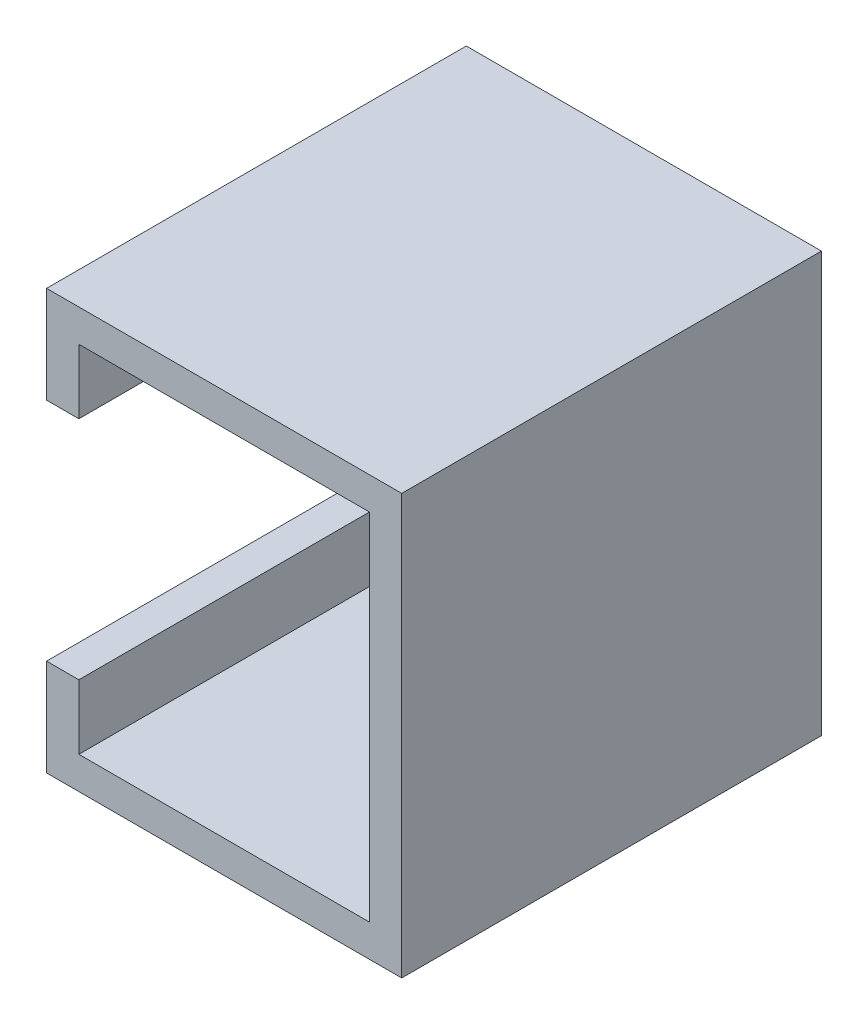
ISO-10303-21;
HEADER;
FILE_DESCRIPTION(('STEP AP214'),'2;1');
FILE_NAME('part.step','',(''),(''),'','','');
FILE_SCHEMA(('AUTOMOTIVE_DESIGN { 1 0 10303 214 1 1 1 1 }'));
ENDSEC;
DATA;
#1=APPLICATION_CONTEXT('core data for automotive mechanical design processes');
#2=APPLICATION_PROTOCOL_DEFINITION('international standard','automotive_design',2000,#1);
#3=PRODUCT_CONTEXT('',#1,'mechanical');
#4=PRODUCT('Part','Part','',(#3));
#5=PRODUCT_RELATED_PRODUCT_CATEGORY('part','',(#4));
#6=PRODUCT_DEFINITION_FORMATION('','',#4);
#7=PRODUCT_DEFINITION_CONTEXT('part definition',#1,'design');
#8=PRODUCT_DEFINITION('design','',#6,#7);
#9=PRODUCT_DEFINITION_SHAPE('','',#8);
#10=(LENGTH_UNIT() NAMED_UNIT(*) SI_UNIT(.MILLI.,.METRE.));
#11=(NAMED_UNIT(*) PLANE_ANGLE_UNIT() SI_UNIT($,.RADIAN.));
#12=(NAMED_UNIT(*) SI_UNIT($,.STERADIAN.) SOLID_ANGLE_UNIT());
#13=UNCERTAINTY_MEASURE_WITH_UNIT(LENGTH_MEASURE(1.E-05),#10,'distance_accuracy_value','');
#14=(GEOMETRIC_REPRESENTATION_CONTEXT(3) GLOBAL_UNCERTAINTY_ASSIGNED_CONTEXT((#13)) GLOBAL_UNIT_ASSIGNED_CONTEXT((#10,
#11,#12)) REPRESENTATION_CONTEXT('',''));
#15=CARTESIAN_POINT('',(0.,0.,0.));
#16=DIRECTION('',(0.,0.,1.));
#17=DIRECTION('',(1.,0.,0.));
#18=AXIS2_PLACEMENT_3D('',#15,#16,#17);
#19=CARTESIAN_POINT('',(1.,0.,0.));
#20=DIRECTION('',(-1.,0.,0.));
#21=DIRECTION('',(0.,0.,1.));
#22=AXIS2_PLACEMENT_3D('',#19,#20,#21);
#23=PLANE('',#22);
#24=DIRECTION('',(0.,-1.,0.));
#25=VECTOR('',#24,1.);
#26=CARTESIAN_POINT('',(1.,0.,0.));
#27=LINE('',#26,#25);
#28=CARTESIAN_POINT('',(1.,12.,0.));
#29=VERTEX_POINT('',#28);
#30=CARTESIAN_POINT('',(1.,10.,0.));
#31=VERTEX_POINT('',#30);
#32=EDGE_CURVE('E209',#29,#31,#27,.T.);
#33=ORIENTED_EDGE('',*,*,#32,.T.);
#34=DIRECTION('',(0.,0.,1.));
#35=VECTOR('',#34,1.);
#36=CARTESIAN_POINT('',(1.,10.,-19.0710678118655));
#37=LINE('',#36,#35);
#38=CARTESIAN_POINT('',(1.,10.,-12.));
#39=VERTEX_POINT('',#38);
#40=EDGE_CURVE('E300',#39,#31,#37,.T.);
#41=ORIENTED_EDGE('',*,*,#40,.F.);
#42=DIRECTION('',(0.,1.,0.));
#43=VECTOR('',#42,1.);
#44=CARTESIAN_POINT('',(1.,0.,-12.));
#45=LINE('',#44,#43);
#46=CARTESIAN_POINT('',(1.,12.,-12.));
#47=VERTEX_POINT('',#46);
#48=EDGE_CURVE('E252',#39,#47,#45,.T.);
#49=ORIENTED_EDGE('',*,*,#48,.T.);
#50=DIRECTION('',(0.,0.,1.));
#51=VECTOR('',#50,1.);
#52=CARTESIAN_POINT('',(1.,12.,0.));
#53=LINE('',#52,#51);
#54=EDGE_CURVE('E251',#47,#29,#53,.T.);
#55=ORIENTED_EDGE('',*,*,#54,.T.);
#56=EDGE_LOOP('',(#33,#41,#49,#55));
#57=FACE_BOUND('',#56,.T.);
#58=ADVANCED_FACE('F39',(#57),#23,.F.);
#59=CARTESIAN_POINT('',(11.,0.,0.));
#60=DIRECTION('',(0.,0.,-1.));
#61=DIRECTION('',(-1.,0.,0.));
#62=AXIS2_PLACEMENT_3D('',#59,#60,#61);
#63=PLANE('',#62);
#64=DIRECTION('',(0.,-1.,0.));
#65=VECTOR('',#64,1.);
#66=CARTESIAN_POINT('',(0.,0.,0.));
#67=LINE('',#66,#65);
#68=CARTESIAN_POINT('',(0.,13.,0.));
#69=VERTEX_POINT('',#68);
#70=CARTESIAN_POINT('',(0.,10.,0.));
#71=VERTEX_POINT('',#70);
#72=EDGE_CURVE('E157',#69,#71,#67,.T.);
#73=ORIENTED_EDGE('',*,*,#72,.T.);
#74=DIRECTION('',(-1.,0.,0.));
#75=VECTOR('',#74,1.);
#76=CARTESIAN_POINT('',(0.,10.,0.));
#77=LINE('',#76,#75);
#78=EDGE_CURVE('E140',#31,#71,#77,.T.);
#79=ORIENTED_EDGE('',*,*,#78,.F.);
#80=ORIENTED_EDGE('',*,*,#32,.F.);
#81=DIRECTION('',(-1.,0.,0.));
#82=VECTOR('',#81,1.);
#83=CARTESIAN_POINT('',(11.,12.,0.));
#84=LINE('',#83,#82);
#85=CARTESIAN_POINT('',(10.,12.,0.));
#86=VERTEX_POINT('',#85);
#87=EDGE_CURVE('E265',#86,#29,#84,.T.);
#88=ORIENTED_EDGE('',*,*,#87,.F.);
#89=DIRECTION('',(0.,-1.,0.));
#90=VECTOR('',#89,1.);
#91=CARTESIAN_POINT('',(10.,0.,0.));
#92=LINE('',#91,#90);
#93=CARTESIAN_POINT('',(10.,1.,0.));
#94=VERTEX_POINT('',#93);
#95=EDGE_CURVE('E63',#86,#94,#92,.T.);
#96=ORIENTED_EDGE('',*,*,#95,.T.);
#97=DIRECTION('',(-1.,0.,0.));
#98=VECTOR('',#97,1.);
#99=CARTESIAN_POINT('',(11.,1.,0.));
#100=LINE('',#99,#98);
#101=CARTESIAN_POINT('',(1.,1.,0.));
#102=VERTEX_POINT('',#101);
#103=EDGE_CURVE('E158',#94,#102,#100,.T.);
#104=ORIENTED_EDGE('',*,*,#103,.T.);
#105=CARTESIAN_POINT('',(1.,3.,0.));
#106=VERTEX_POINT('',#105);
#107=EDGE_CURVE('E149',#106,#102,#27,.T.);
#108=ORIENTED_EDGE('',*,*,#107,.F.);
#109=DIRECTION('',(1.,0.,0.));
#110=VECTOR('',#109,1.);
#111=CARTESIAN_POINT('',(0.,3.,0.));
#112=LINE('',#111,#110);
#113=CARTESIAN_POINT('',(0.,3.,0.));
#114=VERTEX_POINT('',#113);
#115=EDGE_CURVE('E133',#114,#106,#112,.T.);
#116=ORIENTED_EDGE('',*,*,#115,.F.);
#117=CARTESIAN_POINT('',(0.,0.,0.));
#118=VERTEX_POINT('',#117);
#119=EDGE_CURVE('E146',#114,#118,#67,.T.);
#120=ORIENTED_EDGE('',*,*,#119,.T.);
#121=DIRECTION('',(-1.,0.,0.));
#122=VECTOR('',#121,1.);
#123=CARTESIAN_POINT('',(11.,0.,0.));
#124=LINE('',#123,#122);
#125=CARTESIAN_POINT('',(11.,0.,0.));
#126=VERTEX_POINT('',#125);
#127=EDGE_CURVE('E11',#126,#118,#124,.T.);
#128=ORIENTED_EDGE('',*,*,#127,.F.);
#129=DIRECTION('',(0.,-1.,0.));
#130=VECTOR('',#129,1.);
#131=CARTESIAN_POINT('',(11.,0.,0.));
#132=LINE('',#131,#130);
#133=CARTESIAN_POINT('',(11.,13.,0.));
#134=VERTEX_POINT('',#133);
#135=EDGE_CURVE('E176',#134,#126,#132,.T.);
#136=ORIENTED_EDGE('',*,*,#135,.F.);
#137=DIRECTION('',(-1.,0.,0.));
#138=VECTOR('',#137,1.);
#139=CARTESIAN_POINT('',(11.,13.,0.));
#140=LINE('',#139,#138);
#141=EDGE_CURVE('E177',#134,#69,#140,.T.);
#142=ORIENTED_EDGE('',*,*,#141,.T.);
#143=EDGE_LOOP('',(#73,#79,#80,#88,#96,#104,#108,#116,#120,#128,#136,#142));
#144=FACE_BOUND('',#143,.T.);
#145=ADVANCED_FACE('F41',(#144),#63,.F.);
#146=CARTESIAN_POINT('',(11.,0.,0.));
#147=DIRECTION('',(0.,1.,0.));
#148=DIRECTION('',(0.,0.,1.));
#149=AXIS2_PLACEMENT_3D('',#146,#147,#148);
#150=PLANE('',#149);
#151=DIRECTION('',(0.,0.,-1.));
#152=VECTOR('',#151,1.);
#153=CARTESIAN_POINT('',(0.,0.,0.));
#154=LINE('',#153,#152);
#155=CARTESIAN_POINT('',(0.,0.,-13.));
#156=VERTEX_POINT('',#155);
#157=EDGE_CURVE('E155',#118,#156,#154,.T.);
#158=ORIENTED_EDGE('',*,*,#157,.T.);
#159=DIRECTION('',(-1.,0.,0.));
#160=VECTOR('',#159,1.);
#161=CARTESIAN_POINT('',(11.,0.,-13.));
#162=LINE('',#161,#160);
#163=CARTESIAN_POINT('',(11.,0.,-13.));
#164=VERTEX_POINT('',#163);
#165=EDGE_CURVE('E48',#164,#156,#162,.T.);
#166=ORIENTED_EDGE('',*,*,#165,.F.);
#167=DIRECTION('',(0.,0.,-1.));
#168=VECTOR('',#167,1.);
#169=CARTESIAN_POINT('',(11.,0.,0.));
#170=LINE('',#169,#168);
#171=EDGE_CURVE('E204',#126,#164,#170,.T.);
#172=ORIENTED_EDGE('',*,*,#171,.F.);
#173=ORIENTED_EDGE('',*,*,#127,.T.);
#174=EDGE_LOOP('',(#158,#166,#172,#173));
#175=FACE_BOUND('',#174,.T.);
#176=ADVANCED_FACE('F230',(#175),#150,.F.);
#177=CARTESIAN_POINT('',(11.,0.,-13.));
#178=DIRECTION('',(0.,0.,1.));
#179=DIRECTION('',(1.,0.,0.));
#180=AXIS2_PLACEMENT_3D('',#177,#178,#179);
#181=PLANE('',#180);
#182=DIRECTION('',(0.,1.,0.));
#183=VECTOR('',#182,1.);
#184=CARTESIAN_POINT('',(0.,0.,-13.));
#185=LINE('',#184,#183);
#186=CARTESIAN_POINT('',(0.,13.,-13.));
#187=VERTEX_POINT('',#186);
#188=EDGE_CURVE('E170',#156,#187,#185,.T.);
#189=ORIENTED_EDGE('',*,*,#188,.T.);
#190=DIRECTION('',(-1.,0.,0.));
#191=VECTOR('',#190,1.);
#192=CARTESIAN_POINT('',(11.,13.,-13.));
#193=LINE('',#192,#191);
#194=CARTESIAN_POINT('',(11.,13.,-13.));
#195=VERTEX_POINT('',#194);
#196=EDGE_CURVE('E181',#195,#187,#193,.T.);
#197=ORIENTED_EDGE('',*,*,#196,.F.);
#198=DIRECTION('',(0.,1.,0.));
#199=VECTOR('',#198,1.);
#200=CARTESIAN_POINT('',(11.,0.,-13.));
#201=LINE('',#200,#199);
#202=EDGE_CURVE('E191',#164,#195,#201,.T.);
#203=ORIENTED_EDGE('',*,*,#202,.F.);
#204=ORIENTED_EDGE('',*,*,#165,.T.);
#205=EDGE_LOOP('',(#189,#197,#203,#204));
#206=FACE_BOUND('',#205,.T.);
#207=ADVANCED_FACE('F189',(#206),#181,.F.);
#208=CARTESIAN_POINT('',(11.,13.,0.));
#209=DIRECTION('',(0.,-1.,0.));
#210=DIRECTION('',(0.,0.,-1.));
#211=AXIS2_PLACEMENT_3D('',#208,#209,#210);
#212=PLANE('',#211);
#213=DIRECTION('',(0.,0.,1.));
#214=VECTOR('',#213,1.);
#215=CARTESIAN_POINT('',(0.,13.,0.));
#216=LINE('',#215,#214);
#217=EDGE_CURVE('E173',#187,#69,#216,.T.);
#218=ORIENTED_EDGE('',*,*,#217,.T.);
#219=ORIENTED_EDGE('',*,*,#141,.F.);
#220=DIRECTION('',(0.,0.,1.));
#221=VECTOR('',#220,1.);
#222=CARTESIAN_POINT('',(11.,13.,0.));
#223=LINE('',#222,#221);
#224=EDGE_CURVE('E166',#195,#134,#223,.T.);
#225=ORIENTED_EDGE('',*,*,#224,.F.);
#226=ORIENTED_EDGE('',*,*,#196,.T.);
#227=EDGE_LOOP('',(#218,#219,#225,#226));
#228=FACE_BOUND('',#227,.T.);
#229=ADVANCED_FACE('F197',(#228),#212,.F.);
#230=CARTESIAN_POINT('',(11.,0.,0.));
#231=DIRECTION('',(-1.,0.,0.));
#232=DIRECTION('',(0.,0.,1.));
#233=AXIS2_PLACEMENT_3D('',#230,#231,#232);
#234=PLANE('',#233);
#235=ORIENTED_EDGE('',*,*,#135,.T.);
#236=ORIENTED_EDGE('',*,*,#171,.T.);
#237=ORIENTED_EDGE('',*,*,#202,.T.);
#238=ORIENTED_EDGE('',*,*,#224,.T.);
#239=EDGE_LOOP('',(#235,#236,#237,#238));
#240=FACE_BOUND('',#239,.T.);
#241=ADVANCED_FACE('F213',(#240),#234,.F.);
#242=CARTESIAN_POINT('',(0.,0.,0.));
#243=DIRECTION('',(-1.,0.,0.));
#244=DIRECTION('',(0.,0.,1.));
#245=AXIS2_PLACEMENT_3D('',#242,#243,#244);
#246=PLANE('',#245);
#247=DIRECTION('',(0.,0.,1.));
#248=VECTOR('',#247,1.);
#249=CARTESIAN_POINT('',(0.,10.,-19.0710678118655));
#250=LINE('',#249,#248);
#251=CARTESIAN_POINT('',(0.,10.,-12.));
#252=VERTEX_POINT('',#251);
#253=EDGE_CURVE('E302',#252,#71,#250,.T.);
#254=ORIENTED_EDGE('',*,*,#253,.T.);
#255=ORIENTED_EDGE('',*,*,#72,.F.);
#256=ORIENTED_EDGE('',*,*,#217,.F.);
#257=ORIENTED_EDGE('',*,*,#188,.F.);
#258=ORIENTED_EDGE('',*,*,#157,.F.);
#259=ORIENTED_EDGE('',*,*,#119,.F.);
#260=DIRECTION('',(0.,0.,1.));
#261=VECTOR('',#260,1.);
#262=CARTESIAN_POINT('',(0.,3.,-19.0710678118655));
#263=LINE('',#262,#261);
#264=CARTESIAN_POINT('',(0.,3.,-12.));
#265=VERTEX_POINT('',#264);
#266=EDGE_CURVE('E130',#265,#114,#263,.T.);
#267=ORIENTED_EDGE('',*,*,#266,.F.);
#268=DIRECTION('',(0.,1.,0.));
#269=VECTOR('',#268,1.);
#270=CARTESIAN_POINT('',(0.,10.,-12.));
#271=LINE('',#270,#269);
#272=EDGE_CURVE('E286',#265,#252,#271,.T.);
#273=ORIENTED_EDGE('',*,*,#272,.T.);
#274=EDGE_LOOP('',(#254,#255,#256,#257,#258,#259,#267,#273));
#275=FACE_BOUND('',#274,.T.);
#276=ADVANCED_FACE('F153',(#275),#246,.T.);
#277=CARTESIAN_POINT('',(11.,1.,0.));
#278=DIRECTION('',(0.,1.,0.));
#279=DIRECTION('',(0.,0.,1.));
#280=AXIS2_PLACEMENT_3D('',#277,#278,#279);
#281=PLANE('',#280);
#282=DIRECTION('',(0.,0.,-1.));
#283=VECTOR('',#282,1.);
#284=CARTESIAN_POINT('',(1.,1.,0.));
#285=LINE('',#284,#283);
#286=CARTESIAN_POINT('',(1.,1.,-12.));
#287=VERTEX_POINT('',#286);
#288=EDGE_CURVE('E247',#102,#287,#285,.T.);
#289=ORIENTED_EDGE('',*,*,#288,.F.);
#290=ORIENTED_EDGE('',*,*,#103,.F.);
#291=DIRECTION('',(0.,0.,-1.));
#292=VECTOR('',#291,1.);
#293=CARTESIAN_POINT('',(10.,1.,0.));
#294=LINE('',#293,#292);
#295=CARTESIAN_POINT('',(10.,1.,-12.));
#296=VERTEX_POINT('',#295);
#297=EDGE_CURVE('E259',#94,#296,#294,.T.);
#298=ORIENTED_EDGE('',*,*,#297,.T.);
#299=DIRECTION('',(-1.,0.,0.));
#300=VECTOR('',#299,1.);
#301=CARTESIAN_POINT('',(11.,1.,-12.));
#302=LINE('',#301,#300);
#303=EDGE_CURVE('E162',#296,#287,#302,.T.);
#304=ORIENTED_EDGE('',*,*,#303,.T.);
#305=EDGE_LOOP('',(#289,#290,#298,#304));
#306=FACE_BOUND('',#305,.T.);
#307=ADVANCED_FACE('F220',(#306),#281,.T.);
#308=CARTESIAN_POINT('',(11.,0.,-12.));
#309=DIRECTION('',(0.,0.,1.));
#310=DIRECTION('',(1.,0.,0.));
#311=AXIS2_PLACEMENT_3D('',#308,#309,#310);
#312=PLANE('',#311);
#313=CARTESIAN_POINT('',(1.,3.,-12.));
#314=VERTEX_POINT('',#313);
#315=EDGE_CURVE('E245',#287,#314,#45,.T.);
#316=ORIENTED_EDGE('',*,*,#315,.F.);
#317=ORIENTED_EDGE('',*,*,#303,.F.);
#318=DIRECTION('',(0.,1.,0.));
#319=VECTOR('',#318,1.);
#320=CARTESIAN_POINT('',(10.,0.,-12.));
#321=LINE('',#320,#319);
#322=CARTESIAN_POINT('',(10.,12.,-12.));
#323=VERTEX_POINT('',#322);
#324=EDGE_CURVE('E266',#296,#323,#321,.T.);
#325=ORIENTED_EDGE('',*,*,#324,.T.);
#326=DIRECTION('',(-1.,0.,0.));
#327=VECTOR('',#326,1.);
#328=CARTESIAN_POINT('',(11.,12.,-12.));
#329=LINE('',#328,#327);
#330=EDGE_CURVE('E261',#323,#47,#329,.T.);
#331=ORIENTED_EDGE('',*,*,#330,.T.);
#332=ORIENTED_EDGE('',*,*,#48,.F.);
#333=DIRECTION('',(1.,0.,0.));
#334=VECTOR('',#333,1.);
#335=CARTESIAN_POINT('',(0.,10.,-12.));
#336=LINE('',#335,#334);
#337=EDGE_CURVE('E289',#252,#39,#336,.T.);
#338=ORIENTED_EDGE('',*,*,#337,.F.);
#339=ORIENTED_EDGE('',*,*,#272,.F.);
#340=DIRECTION('',(-1.,0.,0.));
#341=VECTOR('',#340,1.);
#342=CARTESIAN_POINT('',(0.,3.,-12.));
#343=LINE('',#342,#341);
#344=EDGE_CURVE('E55',#314,#265,#343,.T.);
#345=ORIENTED_EDGE('',*,*,#344,.F.);
#346=EDGE_LOOP('',(#316,#317,#325,#331,#332,#338,#339,#345));
#347=FACE_BOUND('',#346,.T.);
#348=ADVANCED_FACE('F296',(#347),#312,.T.);
#349=CARTESIAN_POINT('',(11.,12.,0.));
#350=DIRECTION('',(0.,-1.,0.));
#351=DIRECTION('',(0.,0.,-1.));
#352=AXIS2_PLACEMENT_3D('',#349,#350,#351);
#353=PLANE('',#352);
#354=ORIENTED_EDGE('',*,*,#54,.F.);
#355=ORIENTED_EDGE('',*,*,#330,.F.);
#356=DIRECTION('',(0.,0.,1.));
#357=VECTOR('',#356,1.);
#358=CARTESIAN_POINT('',(10.,12.,0.));
#359=LINE('',#358,#357);
#360=EDGE_CURVE('E268',#323,#86,#359,.T.);
#361=ORIENTED_EDGE('',*,*,#360,.T.);
#362=ORIENTED_EDGE('',*,*,#87,.T.);
#363=EDGE_LOOP('',(#354,#355,#361,#362));
#364=FACE_BOUND('',#363,.T.);
#365=ADVANCED_FACE('F243',(#364),#353,.T.);
#366=CARTESIAN_POINT('',(10.,0.,0.));
#367=DIRECTION('',(-1.,0.,0.));
#368=DIRECTION('',(0.,0.,1.));
#369=AXIS2_PLACEMENT_3D('',#366,#367,#368);
#370=PLANE('',#369);
#371=ORIENTED_EDGE('',*,*,#95,.F.);
#372=ORIENTED_EDGE('',*,*,#360,.F.);
#373=ORIENTED_EDGE('',*,*,#324,.F.);
#374=ORIENTED_EDGE('',*,*,#297,.F.);
#375=EDGE_LOOP('',(#371,#372,#373,#374));
#376=FACE_BOUND('',#375,.T.);
#377=ADVANCED_FACE('F235',(#376),#370,.T.);
#378=ORIENTED_EDGE('',*,*,#315,.T.);
#379=DIRECTION('',(0.,0.,1.));
#380=VECTOR('',#379,1.);
#381=CARTESIAN_POINT('',(1.,3.,-19.0710678118655));
#382=LINE('',#381,#380);
#383=EDGE_CURVE('E139',#314,#106,#382,.T.);
#384=ORIENTED_EDGE('',*,*,#383,.T.);
#385=ORIENTED_EDGE('',*,*,#107,.T.);
#386=ORIENTED_EDGE('',*,*,#288,.T.);
#387=EDGE_LOOP('',(#378,#384,#385,#386));
#388=FACE_BOUND('',#387,.T.);
#389=ADVANCED_FACE('F226',(#388),#23,.F.);
#390=CARTESIAN_POINT('',(0.,10.,-19.0710678118655));
#391=DIRECTION('',(0.,1.,0.));
#392=DIRECTION('',(0.,0.,1.));
#393=AXIS2_PLACEMENT_3D('',#390,#391,#392);
#394=PLANE('',#393);
#395=ORIENTED_EDGE('',*,*,#337,.T.);
#396=ORIENTED_EDGE('',*,*,#40,.T.);
#397=ORIENTED_EDGE('',*,*,#78,.T.);
#398=ORIENTED_EDGE('',*,*,#253,.F.);
#399=EDGE_LOOP('',(#395,#396,#397,#398));
#400=FACE_BOUND('',#399,.T.);
#401=ADVANCED_FACE('F234',(#400),#394,.F.);
#402=CARTESIAN_POINT('',(0.,3.,-19.0710678118655));
#403=DIRECTION('',(0.,-1.,0.));
#404=DIRECTION('',(0.,0.,-1.));
#405=AXIS2_PLACEMENT_3D('',#402,#403,#404);
#406=PLANE('',#405);
#407=ORIENTED_EDGE('',*,*,#344,.T.);
#408=ORIENTED_EDGE('',*,*,#266,.T.);
#409=ORIENTED_EDGE('',*,*,#115,.T.);
#410=ORIENTED_EDGE('',*,*,#383,.F.);
#411=EDGE_LOOP('',(#407,#408,#409,#410));
#412=FACE_BOUND('',#411,.T.);
#413=ADVANCED_FACE('F132',(#412),#406,.F.);
#414=CLOSED_SHELL('',(#58,#145,#176,#207,#229,#241,#276,#307,#348,#365,#377,#389,#401,#413));
#415=MANIFOLD_SOLID_BREP('B2',#414);
#416=ADVANCED_BREP_SHAPE_REPRESENTATION('',(#18,#415),#14);
#417=SHAPE_DEFINITION_REPRESENTATION(#9,#416);
ENDSEC;
END-ISO-10303-21;
